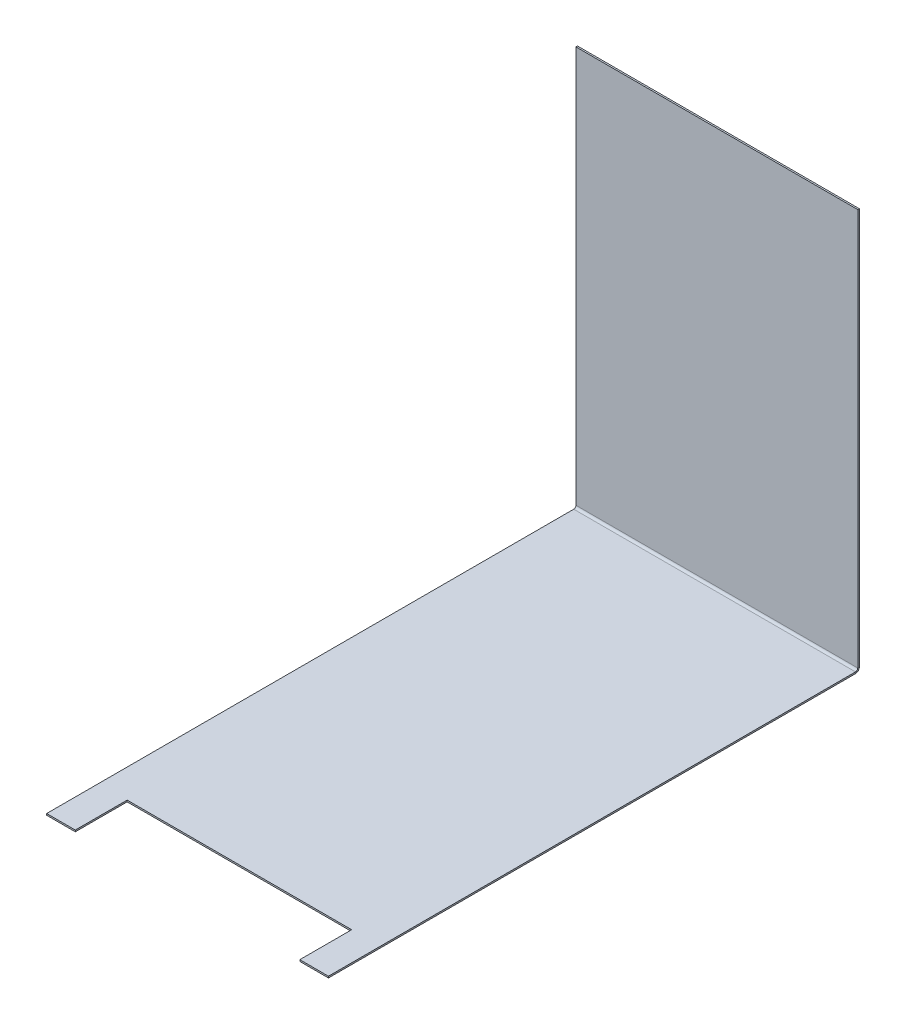
ISO-10303-21;
HEADER;
FILE_DESCRIPTION(('STEP AP214'),'2;1');
FILE_NAME('part.step','',(''),(''),'','','');
FILE_SCHEMA(('AUTOMOTIVE_DESIGN { 1 0 10303 214 1 1 1 1 }'));
ENDSEC;
DATA;
#1=APPLICATION_CONTEXT('core data for automotive mechanical design processes');
#2=APPLICATION_PROTOCOL_DEFINITION('international standard','automotive_design',2000,#1);
#3=PRODUCT_CONTEXT('',#1,'mechanical');
#4=PRODUCT('Part','Part','',(#3));
#5=PRODUCT_RELATED_PRODUCT_CATEGORY('part','',(#4));
#6=PRODUCT_DEFINITION_FORMATION('','',#4);
#7=PRODUCT_DEFINITION_CONTEXT('part definition',#1,'design');
#8=PRODUCT_DEFINITION('design','',#6,#7);
#9=PRODUCT_DEFINITION_SHAPE('','',#8);
#10=(LENGTH_UNIT() NAMED_UNIT(*) SI_UNIT(.MILLI.,.METRE.));
#11=(NAMED_UNIT(*) PLANE_ANGLE_UNIT() SI_UNIT($,.RADIAN.));
#12=(NAMED_UNIT(*) SI_UNIT($,.STERADIAN.) SOLID_ANGLE_UNIT());
#13=UNCERTAINTY_MEASURE_WITH_UNIT(LENGTH_MEASURE(1.E-05),#10,'distance_accuracy_value','');
#14=(GEOMETRIC_REPRESENTATION_CONTEXT(3) GLOBAL_UNCERTAINTY_ASSIGNED_CONTEXT((#13)) GLOBAL_UNIT_ASSIGNED_CONTEXT((#10,
#11,#12)) REPRESENTATION_CONTEXT('',''));
#15=CARTESIAN_POINT('',(0.,0.,0.));
#16=DIRECTION('',(0.,0.,1.));
#17=DIRECTION('',(1.,0.,0.));
#18=AXIS2_PLACEMENT_3D('',#15,#16,#17);
#19=CARTESIAN_POINT('',(62.5,-0.7,105.));
#20=DIRECTION('',(1.,0.,0.));
#21=DIRECTION('',(0.,0.,-1.));
#22=AXIS2_PLACEMENT_3D('',#19,#20,#21);
#23=PLANE('',#22);
#24=DIRECTION('',(0.,0.,-1.));
#25=VECTOR('',#24,1.);
#26=CARTESIAN_POINT('',(62.5,0.,105.));
#27=LINE('',#26,#25);
#28=CARTESIAN_POINT('',(62.5,0.,128.));
#29=VERTEX_POINT('',#28);
#30=CARTESIAN_POINT('',(62.5,0.,-105.8));
#31=VERTEX_POINT('',#30);
#32=EDGE_CURVE('E317',#29,#31,#27,.T.);
#33=ORIENTED_EDGE('',*,*,#32,.F.);
#34=DIRECTION('',(0.,1.,0.));
#35=VECTOR('',#34,1.);
#36=CARTESIAN_POINT('',(62.5,-0.7,128.));
#37=LINE('',#36,#35);
#38=CARTESIAN_POINT('',(62.5,-0.7,128.));
#39=VERTEX_POINT('',#38);
#40=EDGE_CURVE('E236',#39,#29,#37,.T.);
#41=ORIENTED_EDGE('',*,*,#40,.F.);
#42=DIRECTION('',(0.,0.,-1.));
#43=VECTOR('',#42,1.);
#44=CARTESIAN_POINT('',(62.5,-0.7,105.));
#45=LINE('',#44,#43);
#46=CARTESIAN_POINT('',(62.5,-0.700000000000007,-105.8));
#47=VERTEX_POINT('',#46);
#48=EDGE_CURVE('E320',#39,#47,#45,.T.);
#49=ORIENTED_EDGE('',*,*,#48,.T.);
#50=DIRECTION('',(0.,-1.,0.));
#51=VECTOR('',#50,1.);
#52=CARTESIAN_POINT('',(62.5,0.,-105.8));
#53=LINE('',#52,#51);
#54=EDGE_CURVE('E315',#31,#47,#53,.T.);
#55=ORIENTED_EDGE('',*,*,#54,.F.);
#56=EDGE_LOOP('',(#33,#41,#49,#55));
#57=FACE_BOUND('',#56,.T.);
#58=ADVANCED_FACE('F57',(#57),#23,.T.);
#59=CARTESIAN_POINT('',(-62.5,-0.7,105.));
#60=DIRECTION('',(0.,0.,1.));
#61=DIRECTION('',(1.,0.,0.));
#62=AXIS2_PLACEMENT_3D('',#59,#60,#61);
#63=PLANE('',#62);
#64=DIRECTION('',(0.,1.,0.));
#65=VECTOR('',#64,1.);
#66=CARTESIAN_POINT('',(49.8,-0.7,105.));
#67=LINE('',#66,#65);
#68=CARTESIAN_POINT('',(49.8,-0.7,105.));
#69=VERTEX_POINT('',#68);
#70=CARTESIAN_POINT('',(49.8,0.,105.));
#71=VERTEX_POINT('',#70);
#72=EDGE_CURVE('E147',#69,#71,#67,.T.);
#73=ORIENTED_EDGE('',*,*,#72,.T.);
#74=DIRECTION('',(1.,0.,0.));
#75=VECTOR('',#74,1.);
#76=CARTESIAN_POINT('',(-62.5,0.,105.));
#77=LINE('',#76,#75);
#78=CARTESIAN_POINT('',(-49.8,0.,105.));
#79=VERTEX_POINT('',#78);
#80=EDGE_CURVE('E323',#79,#71,#77,.T.);
#81=ORIENTED_EDGE('',*,*,#80,.F.);
#82=DIRECTION('',(0.,1.,0.));
#83=VECTOR('',#82,1.);
#84=CARTESIAN_POINT('',(-49.8,-0.7,105.));
#85=LINE('',#84,#83);
#86=CARTESIAN_POINT('',(-49.8,-0.7,105.));
#87=VERTEX_POINT('',#86);
#88=EDGE_CURVE('E72',#87,#79,#85,.T.);
#89=ORIENTED_EDGE('',*,*,#88,.F.);
#90=DIRECTION('',(1.,0.,0.));
#91=VECTOR('',#90,1.);
#92=CARTESIAN_POINT('',(-62.5,-0.7,105.));
#93=LINE('',#92,#91);
#94=EDGE_CURVE('E13',#87,#69,#93,.T.);
#95=ORIENTED_EDGE('',*,*,#94,.T.);
#96=EDGE_LOOP('',(#73,#81,#89,#95));
#97=FACE_BOUND('',#96,.T.);
#98=ADVANCED_FACE('F165',(#97),#63,.T.);
#99=CARTESIAN_POINT('',(-62.5,-0.7,105.));
#100=DIRECTION('',(-1.,0.,0.));
#101=DIRECTION('',(0.,0.,1.));
#102=AXIS2_PLACEMENT_3D('',#99,#100,#101);
#103=PLANE('',#102);
#104=DIRECTION('',(0.,0.,1.));
#105=VECTOR('',#104,1.);
#106=CARTESIAN_POINT('',(-62.5,0.,105.));
#107=LINE('',#106,#105);
#108=CARTESIAN_POINT('',(-62.5,0.,-105.8));
#109=VERTEX_POINT('',#108);
#110=CARTESIAN_POINT('',(-62.5,0.,128.));
#111=VERTEX_POINT('',#110);
#112=EDGE_CURVE('E327',#109,#111,#107,.T.);
#113=ORIENTED_EDGE('',*,*,#112,.F.);
#114=DIRECTION('',(0.,-1.,0.));
#115=VECTOR('',#114,1.);
#116=CARTESIAN_POINT('',(-62.5,0.,-105.8));
#117=LINE('',#116,#115);
#118=CARTESIAN_POINT('',(-62.5,-0.700000000000007,-105.8));
#119=VERTEX_POINT('',#118);
#120=EDGE_CURVE('E305',#109,#119,#117,.T.);
#121=ORIENTED_EDGE('',*,*,#120,.T.);
#122=DIRECTION('',(0.,0.,1.));
#123=VECTOR('',#122,1.);
#124=CARTESIAN_POINT('',(-62.5,-0.7,105.));
#125=LINE('',#124,#123);
#126=CARTESIAN_POINT('',(-62.5,-0.7,128.));
#127=VERTEX_POINT('',#126);
#128=EDGE_CURVE('E65',#119,#127,#125,.T.);
#129=ORIENTED_EDGE('',*,*,#128,.T.);
#130=DIRECTION('',(0.,1.,0.));
#131=VECTOR('',#130,1.);
#132=CARTESIAN_POINT('',(-62.5,-0.7,128.));
#133=LINE('',#132,#131);
#134=EDGE_CURVE('E264',#127,#111,#133,.T.);
#135=ORIENTED_EDGE('',*,*,#134,.T.);
#136=EDGE_LOOP('',(#113,#121,#129,#135));
#137=FACE_BOUND('',#136,.T.);
#138=ADVANCED_FACE('F167',(#137),#103,.T.);
#139=CARTESIAN_POINT('',(0.,-0.7,0.));
#140=DIRECTION('',(0.,-1.,0.));
#141=DIRECTION('',(0.,0.,-1.));
#142=AXIS2_PLACEMENT_3D('',#139,#140,#141);
#143=PLANE('',#142);
#144=ORIENTED_EDGE('',*,*,#48,.F.);
#145=DIRECTION('',(1.,0.,0.));
#146=VECTOR('',#145,1.);
#147=CARTESIAN_POINT('',(62.5,-0.7,128.));
#148=LINE('',#147,#146);
#149=CARTESIAN_POINT('',(49.8,-0.7,128.));
#150=VERTEX_POINT('',#149);
#151=EDGE_CURVE('E156',#150,#39,#148,.T.);
#152=ORIENTED_EDGE('',*,*,#151,.F.);
#153=DIRECTION('',(0.,0.,1.));
#154=VECTOR('',#153,1.);
#155=CARTESIAN_POINT('',(49.8,-0.7,105.));
#156=LINE('',#155,#154);
#157=EDGE_CURVE('E150',#69,#150,#156,.T.);
#158=ORIENTED_EDGE('',*,*,#157,.F.);
#159=ORIENTED_EDGE('',*,*,#94,.F.);
#160=DIRECTION('',(0.,0.,-1.));
#161=VECTOR('',#160,1.);
#162=CARTESIAN_POINT('',(-49.8,-0.7,105.));
#163=LINE('',#162,#161);
#164=CARTESIAN_POINT('',(-49.8,-0.7,128.));
#165=VERTEX_POINT('',#164);
#166=EDGE_CURVE('E248',#165,#87,#163,.T.);
#167=ORIENTED_EDGE('',*,*,#166,.F.);
#168=DIRECTION('',(1.,0.,0.));
#169=VECTOR('',#168,1.);
#170=CARTESIAN_POINT('',(-62.5,-0.7,128.));
#171=LINE('',#170,#169);
#172=EDGE_CURVE('E245',#127,#165,#171,.T.);
#173=ORIENTED_EDGE('',*,*,#172,.F.);
#174=ORIENTED_EDGE('',*,*,#128,.F.);
#175=DIRECTION('',(-1.,0.,0.));
#176=VECTOR('',#175,1.);
#177=CARTESIAN_POINT('',(-62.5,-0.700000000000007,-105.8));
#178=LINE('',#177,#176);
#179=EDGE_CURVE('E300',#119,#47,#178,.F.);
#180=ORIENTED_EDGE('',*,*,#179,.T.);
#181=EDGE_LOOP('',(#144,#152,#158,#159,#167,#173,#174,#180));
#182=FACE_BOUND('',#181,.T.);
#183=ADVANCED_FACE('F159',(#182),#143,.T.);
#184=CARTESIAN_POINT('',(0.,0.,0.));
#185=DIRECTION('',(0.,-1.,0.));
#186=DIRECTION('',(0.,0.,-1.));
#187=AXIS2_PLACEMENT_3D('',#184,#185,#186);
#188=PLANE('',#187);
#189=ORIENTED_EDGE('',*,*,#32,.T.);
#190=DIRECTION('',(-1.,0.,0.));
#191=VECTOR('',#190,1.);
#192=CARTESIAN_POINT('',(-62.5,0.,-105.8));
#193=LINE('',#192,#191);
#194=EDGE_CURVE('E311',#109,#31,#193,.F.);
#195=ORIENTED_EDGE('',*,*,#194,.F.);
#196=ORIENTED_EDGE('',*,*,#112,.T.);
#197=DIRECTION('',(1.,0.,0.));
#198=VECTOR('',#197,1.);
#199=CARTESIAN_POINT('',(-62.5,0.,128.));
#200=LINE('',#199,#198);
#201=CARTESIAN_POINT('',(-49.8,0.,128.));
#202=VERTEX_POINT('',#201);
#203=EDGE_CURVE('E243',#111,#202,#200,.T.);
#204=ORIENTED_EDGE('',*,*,#203,.T.);
#205=DIRECTION('',(0.,0.,-1.));
#206=VECTOR('',#205,1.);
#207=CARTESIAN_POINT('',(-49.8,0.,105.));
#208=LINE('',#207,#206);
#209=EDGE_CURVE('E249',#202,#79,#208,.T.);
#210=ORIENTED_EDGE('',*,*,#209,.T.);
#211=ORIENTED_EDGE('',*,*,#80,.T.);
#212=DIRECTION('',(0.,0.,1.));
#213=VECTOR('',#212,1.);
#214=CARTESIAN_POINT('',(49.8,0.,105.));
#215=LINE('',#214,#213);
#216=CARTESIAN_POINT('',(49.8,0.,128.));
#217=VERTEX_POINT('',#216);
#218=EDGE_CURVE('E153',#71,#217,#215,.T.);
#219=ORIENTED_EDGE('',*,*,#218,.T.);
#220=DIRECTION('',(1.,0.,0.));
#221=VECTOR('',#220,1.);
#222=CARTESIAN_POINT('',(62.5,0.,128.));
#223=LINE('',#222,#221);
#224=EDGE_CURVE('E163',#217,#29,#223,.T.);
#225=ORIENTED_EDGE('',*,*,#224,.T.);
#226=EDGE_LOOP('',(#189,#195,#196,#204,#210,#211,#219,#225));
#227=FACE_BOUND('',#226,.T.);
#228=ADVANCED_FACE('F176',(#227),#188,.F.);
#229=CARTESIAN_POINT('',(62.5,0.999999999999994,-105.8));
#230=DIRECTION('',(1.,0.,0.));
#231=DIRECTION('',(0.,0.,-1.));
#232=AXIS2_PLACEMENT_3D('',#229,#230,#231);
#233=PLANE('',#232);
#234=DIRECTION('',(0.,0.,1.));
#235=VECTOR('',#234,1.);
#236=CARTESIAN_POINT('',(62.5,1.00000000000001,-107.5));
#237=LINE('',#236,#235);
#238=CARTESIAN_POINT('',(62.5,0.99999999999999,-106.8));
#239=VERTEX_POINT('',#238);
#240=CARTESIAN_POINT('',(62.5,0.999999999999988,-107.5));
#241=VERTEX_POINT('',#240);
#242=EDGE_CURVE('E258',#239,#241,#237,.F.);
#243=ORIENTED_EDGE('',*,*,#242,.F.);
#244=CARTESIAN_POINT('',(62.5,0.999999999999994,-105.8));
#245=DIRECTION('',(-1.,0.,0.));
#246=DIRECTION('',(0.,0.,1.));
#247=AXIS2_PLACEMENT_3D('',#244,#245,#246);
#248=CIRCLE('',#247,1.);
#249=EDGE_CURVE('E308',#31,#239,#248,.F.);
#250=ORIENTED_EDGE('',*,*,#249,.F.);
#251=ORIENTED_EDGE('',*,*,#54,.T.);
#252=CARTESIAN_POINT('',(62.5,0.999999999999994,-105.8));
#253=DIRECTION('',(-1.,0.,0.));
#254=DIRECTION('',(0.,0.,1.));
#255=AXIS2_PLACEMENT_3D('',#252,#253,#254);
#256=CIRCLE('',#255,1.7);
#257=EDGE_CURVE('E80',#47,#241,#256,.F.);
#258=ORIENTED_EDGE('',*,*,#257,.T.);
#259=EDGE_LOOP('',(#243,#250,#251,#258));
#260=FACE_BOUND('',#259,.T.);
#261=ADVANCED_FACE('F179',(#260),#233,.T.);
#262=CARTESIAN_POINT('',(-62.5,0.999999999999994,-105.8));
#263=DIRECTION('',(1.,0.,0.));
#264=DIRECTION('',(0.,0.,-1.));
#265=AXIS2_PLACEMENT_3D('',#262,#263,#264);
#266=PLANE('',#265);
#267=CARTESIAN_POINT('',(-62.5,0.999999999999994,-105.8));
#268=DIRECTION('',(-1.,0.,0.));
#269=DIRECTION('',(0.,0.,1.));
#270=AXIS2_PLACEMENT_3D('',#267,#268,#269);
#271=CIRCLE('',#270,1.);
#272=CARTESIAN_POINT('',(-62.5,0.99999999999999,-106.8));
#273=VERTEX_POINT('',#272);
#274=EDGE_CURVE('E273',#273,#109,#271,.T.);
#275=ORIENTED_EDGE('',*,*,#274,.F.);
#276=DIRECTION('',(0.,0.,1.));
#277=VECTOR('',#276,1.);
#278=CARTESIAN_POINT('',(-62.5,1.,-106.8));
#279=LINE('',#278,#277);
#280=CARTESIAN_POINT('',(-62.5,1.00000000000001,-107.5));
#281=VERTEX_POINT('',#280);
#282=EDGE_CURVE('E293',#273,#281,#279,.F.);
#283=ORIENTED_EDGE('',*,*,#282,.T.);
#284=CARTESIAN_POINT('',(-62.5,0.999999999999994,-105.8));
#285=DIRECTION('',(-1.,0.,0.));
#286=DIRECTION('',(0.,0.,1.));
#287=AXIS2_PLACEMENT_3D('',#284,#285,#286);
#288=CIRCLE('',#287,1.7);
#289=EDGE_CURVE('E303',#281,#119,#288,.T.);
#290=ORIENTED_EDGE('',*,*,#289,.T.);
#291=ORIENTED_EDGE('',*,*,#120,.F.);
#292=EDGE_LOOP('',(#275,#283,#290,#291));
#293=FACE_BOUND('',#292,.T.);
#294=ADVANCED_FACE('F183',(#293),#266,.F.);
#295=CARTESIAN_POINT('',(-62.5,0.999999999999994,-105.8));
#296=DIRECTION('',(-1.,0.,0.));
#297=DIRECTION('',(0.,0.,-1.));
#298=AXIS2_PLACEMENT_3D('',#295,#296,#297);
#299=CYLINDRICAL_SURFACE('',#298,1.7);
#300=ORIENTED_EDGE('',*,*,#179,.F.);
#301=ORIENTED_EDGE('',*,*,#289,.F.);
#302=DIRECTION('',(-1.,0.,0.));
#303=VECTOR('',#302,1.);
#304=CARTESIAN_POINT('',(62.5,1.00000000000001,-107.5));
#305=LINE('',#304,#303);
#306=EDGE_CURVE('E291',#281,#241,#305,.F.);
#307=ORIENTED_EDGE('',*,*,#306,.T.);
#308=ORIENTED_EDGE('',*,*,#257,.F.);
#309=EDGE_LOOP('',(#300,#301,#307,#308));
#310=FACE_BOUND('',#309,.T.);
#311=ADVANCED_FACE('F186',(#310),#299,.T.);
#312=CARTESIAN_POINT('',(-62.5,0.999999999999994,-105.8));
#313=DIRECTION('',(-1.,0.,0.));
#314=DIRECTION('',(0.,0.,-1.));
#315=AXIS2_PLACEMENT_3D('',#312,#313,#314);
#316=CYLINDRICAL_SURFACE('',#315,1.);
#317=ORIENTED_EDGE('',*,*,#194,.T.);
#318=ORIENTED_EDGE('',*,*,#249,.T.);
#319=DIRECTION('',(-1.,0.,0.));
#320=VECTOR('',#319,1.);
#321=CARTESIAN_POINT('',(62.5,1.,-106.8));
#322=LINE('',#321,#320);
#323=EDGE_CURVE('E296',#239,#273,#322,.T.);
#324=ORIENTED_EDGE('',*,*,#323,.T.);
#325=ORIENTED_EDGE('',*,*,#274,.T.);
#326=EDGE_LOOP('',(#317,#318,#324,#325));
#327=FACE_BOUND('',#326,.T.);
#328=ADVANCED_FACE('F191',(#327),#316,.F.);
#329=CARTESIAN_POINT('',(62.5,0.,-107.5));
#330=DIRECTION('',(-1.,0.,0.));
#331=DIRECTION('',(0.,0.,1.));
#332=AXIS2_PLACEMENT_3D('',#329,#330,#331);
#333=PLANE('',#332);
#334=ORIENTED_EDGE('',*,*,#242,.T.);
#335=DIRECTION('',(0.,-1.,0.));
#336=VECTOR('',#335,1.);
#337=CARTESIAN_POINT('',(62.5,-3.7270122153303E-13,-107.5));
#338=LINE('',#337,#336);
#339=CARTESIAN_POINT('',(62.5,177.1,-107.500000000001));
#340=VERTEX_POINT('',#339);
#341=EDGE_CURVE('E281',#340,#241,#338,.T.);
#342=ORIENTED_EDGE('',*,*,#341,.F.);
#343=DIRECTION('',(0.,0.,1.));
#344=VECTOR('',#343,1.);
#345=CARTESIAN_POINT('',(62.5,177.1,-107.500000000001));
#346=LINE('',#345,#344);
#347=CARTESIAN_POINT('',(62.5,177.1,-106.800000000001));
#348=VERTEX_POINT('',#347);
#349=EDGE_CURVE('E274',#340,#348,#346,.T.);
#350=ORIENTED_EDGE('',*,*,#349,.T.);
#351=DIRECTION('',(0.,1.,0.));
#352=VECTOR('',#351,1.);
#353=CARTESIAN_POINT('',(62.5,0.,-106.8));
#354=LINE('',#353,#352);
#355=EDGE_CURVE('E288',#348,#239,#354,.F.);
#356=ORIENTED_EDGE('',*,*,#355,.T.);
#357=EDGE_LOOP('',(#334,#342,#350,#356));
#358=FACE_BOUND('',#357,.T.);
#359=ADVANCED_FACE('F194',(#358),#333,.F.);
#360=CARTESIAN_POINT('',(-62.5,177.1,-107.500000000001));
#361=DIRECTION('',(1.,0.,0.));
#362=DIRECTION('',(0.,1.,0.));
#363=AXIS2_PLACEMENT_3D('',#360,#361,#362);
#364=PLANE('',#363);
#365=ORIENTED_EDGE('',*,*,#282,.F.);
#366=DIRECTION('',(0.,-1.,0.));
#367=VECTOR('',#366,1.);
#368=CARTESIAN_POINT('',(-62.5,177.1,-106.800000000001));
#369=LINE('',#368,#367);
#370=CARTESIAN_POINT('',(-62.5,177.1,-106.800000000001));
#371=VERTEX_POINT('',#370);
#372=EDGE_CURVE('E286',#273,#371,#369,.F.);
#373=ORIENTED_EDGE('',*,*,#372,.T.);
#374=DIRECTION('',(0.,0.,1.));
#375=VECTOR('',#374,1.);
#376=CARTESIAN_POINT('',(-62.5,177.1,-107.500000000001));
#377=LINE('',#376,#375);
#378=CARTESIAN_POINT('',(-62.5,177.1,-107.500000000001));
#379=VERTEX_POINT('',#378);
#380=EDGE_CURVE('E270',#379,#371,#377,.T.);
#381=ORIENTED_EDGE('',*,*,#380,.F.);
#382=DIRECTION('',(0.,1.,0.));
#383=VECTOR('',#382,1.);
#384=CARTESIAN_POINT('',(-62.5,-3.65354848822796E-13,-107.5));
#385=LINE('',#384,#383);
#386=EDGE_CURVE('E279',#281,#379,#385,.T.);
#387=ORIENTED_EDGE('',*,*,#386,.F.);
#388=EDGE_LOOP('',(#365,#373,#381,#387));
#389=FACE_BOUND('',#388,.T.);
#390=ADVANCED_FACE('F200',(#389),#364,.F.);
#391=CARTESIAN_POINT('',(0.,-3.7270122153303E-13,-107.5));
#392=DIRECTION('',(0.,0.,1.));
#393=DIRECTION('',(0.,-1.,0.));
#394=AXIS2_PLACEMENT_3D('',#391,#392,#393);
#395=PLANE('',#394);
#396=ORIENTED_EDGE('',*,*,#306,.F.);
#397=ORIENTED_EDGE('',*,*,#386,.T.);
#398=DIRECTION('',(1.,0.,0.));
#399=VECTOR('',#398,1.);
#400=CARTESIAN_POINT('',(0.,177.1,-107.500000000001));
#401=LINE('',#400,#399);
#402=EDGE_CURVE('E277',#379,#340,#401,.T.);
#403=ORIENTED_EDGE('',*,*,#402,.T.);
#404=ORIENTED_EDGE('',*,*,#341,.T.);
#405=EDGE_LOOP('',(#396,#397,#403,#404));
#406=FACE_BOUND('',#405,.T.);
#407=ADVANCED_FACE('F204',(#406),#395,.F.);
#408=CARTESIAN_POINT('',(0.,-3.7025718459584E-13,-106.8));
#409=DIRECTION('',(0.,0.,1.));
#410=DIRECTION('',(0.,-1.,0.));
#411=AXIS2_PLACEMENT_3D('',#408,#409,#410);
#412=PLANE('',#411);
#413=ORIENTED_EDGE('',*,*,#372,.F.);
#414=ORIENTED_EDGE('',*,*,#323,.F.);
#415=ORIENTED_EDGE('',*,*,#355,.F.);
#416=DIRECTION('',(-1.,0.,0.));
#417=VECTOR('',#416,1.);
#418=CARTESIAN_POINT('',(62.5,177.1,-106.800000000001));
#419=LINE('',#418,#417);
#420=EDGE_CURVE('E284',#371,#348,#419,.F.);
#421=ORIENTED_EDGE('',*,*,#420,.F.);
#422=EDGE_LOOP('',(#413,#414,#415,#421));
#423=FACE_BOUND('',#422,.T.);
#424=ADVANCED_FACE('F210',(#423),#412,.T.);
#425=CARTESIAN_POINT('',(62.5,177.1,-107.500000000001));
#426=DIRECTION('',(0.,-1.,0.));
#427=DIRECTION('',(0.,0.,-1.));
#428=AXIS2_PLACEMENT_3D('',#425,#426,#427);
#429=PLANE('',#428);
#430=ORIENTED_EDGE('',*,*,#420,.T.);
#431=ORIENTED_EDGE('',*,*,#349,.F.);
#432=ORIENTED_EDGE('',*,*,#402,.F.);
#433=ORIENTED_EDGE('',*,*,#380,.T.);
#434=EDGE_LOOP('',(#430,#431,#432,#433));
#435=FACE_BOUND('',#434,.T.);
#436=ADVANCED_FACE('F206',(#435),#429,.F.);
#437=CARTESIAN_POINT('',(-49.8,-0.7,105.));
#438=DIRECTION('',(1.,0.,0.));
#439=DIRECTION('',(0.,0.,-1.));
#440=AXIS2_PLACEMENT_3D('',#437,#438,#439);
#441=PLANE('',#440);
#442=ORIENTED_EDGE('',*,*,#209,.F.);
#443=DIRECTION('',(0.,1.,0.));
#444=VECTOR('',#443,1.);
#445=CARTESIAN_POINT('',(-49.8,-0.7,128.));
#446=LINE('',#445,#444);
#447=EDGE_CURVE('E254',#165,#202,#446,.T.);
#448=ORIENTED_EDGE('',*,*,#447,.F.);
#449=ORIENTED_EDGE('',*,*,#166,.T.);
#450=ORIENTED_EDGE('',*,*,#88,.T.);
#451=EDGE_LOOP('',(#442,#448,#449,#450));
#452=FACE_BOUND('',#451,.T.);
#453=ADVANCED_FACE('F209',(#452),#441,.T.);
#454=CARTESIAN_POINT('',(-62.5,-0.7,128.));
#455=DIRECTION('',(0.,0.,1.));
#456=DIRECTION('',(1.,0.,0.));
#457=AXIS2_PLACEMENT_3D('',#454,#455,#456);
#458=PLANE('',#457);
#459=ORIENTED_EDGE('',*,*,#203,.F.);
#460=ORIENTED_EDGE('',*,*,#134,.F.);
#461=ORIENTED_EDGE('',*,*,#172,.T.);
#462=ORIENTED_EDGE('',*,*,#447,.T.);
#463=EDGE_LOOP('',(#459,#460,#461,#462));
#464=FACE_BOUND('',#463,.T.);
#465=ADVANCED_FACE('F218',(#464),#458,.T.);
#466=CARTESIAN_POINT('',(62.5,-0.7,128.));
#467=DIRECTION('',(0.,0.,1.));
#468=DIRECTION('',(1.,0.,0.));
#469=AXIS2_PLACEMENT_3D('',#466,#467,#468);
#470=PLANE('',#469);
#471=ORIENTED_EDGE('',*,*,#224,.F.);
#472=DIRECTION('',(0.,1.,0.));
#473=VECTOR('',#472,1.);
#474=CARTESIAN_POINT('',(49.8,-0.7,128.));
#475=LINE('',#474,#473);
#476=EDGE_CURVE('E155',#150,#217,#475,.T.);
#477=ORIENTED_EDGE('',*,*,#476,.F.);
#478=ORIENTED_EDGE('',*,*,#151,.T.);
#479=ORIENTED_EDGE('',*,*,#40,.T.);
#480=EDGE_LOOP('',(#471,#477,#478,#479));
#481=FACE_BOUND('',#480,.T.);
#482=ADVANCED_FACE('F221',(#481),#470,.T.);
#483=CARTESIAN_POINT('',(49.8,-0.7,105.));
#484=DIRECTION('',(-1.,0.,0.));
#485=DIRECTION('',(0.,0.,1.));
#486=AXIS2_PLACEMENT_3D('',#483,#484,#485);
#487=PLANE('',#486);
#488=ORIENTED_EDGE('',*,*,#218,.F.);
#489=ORIENTED_EDGE('',*,*,#72,.F.);
#490=ORIENTED_EDGE('',*,*,#157,.T.);
#491=ORIENTED_EDGE('',*,*,#476,.T.);
#492=EDGE_LOOP('',(#488,#489,#490,#491));
#493=FACE_BOUND('',#492,.T.);
#494=ADVANCED_FACE('F149',(#493),#487,.T.);
#495=CLOSED_SHELL('',(#58,#98,#138,#183,#228,#261,#294,#311,#328,#359,#390,#407,#424,#436,#453,
#465,#482,#494));
#496=MANIFOLD_SOLID_BREP('B2',#495);
#497=ADVANCED_BREP_SHAPE_REPRESENTATION('',(#18,#496),#14);
#498=SHAPE_DEFINITION_REPRESENTATION(#9,#497);
ENDSEC;
END-ISO-10303-21;
